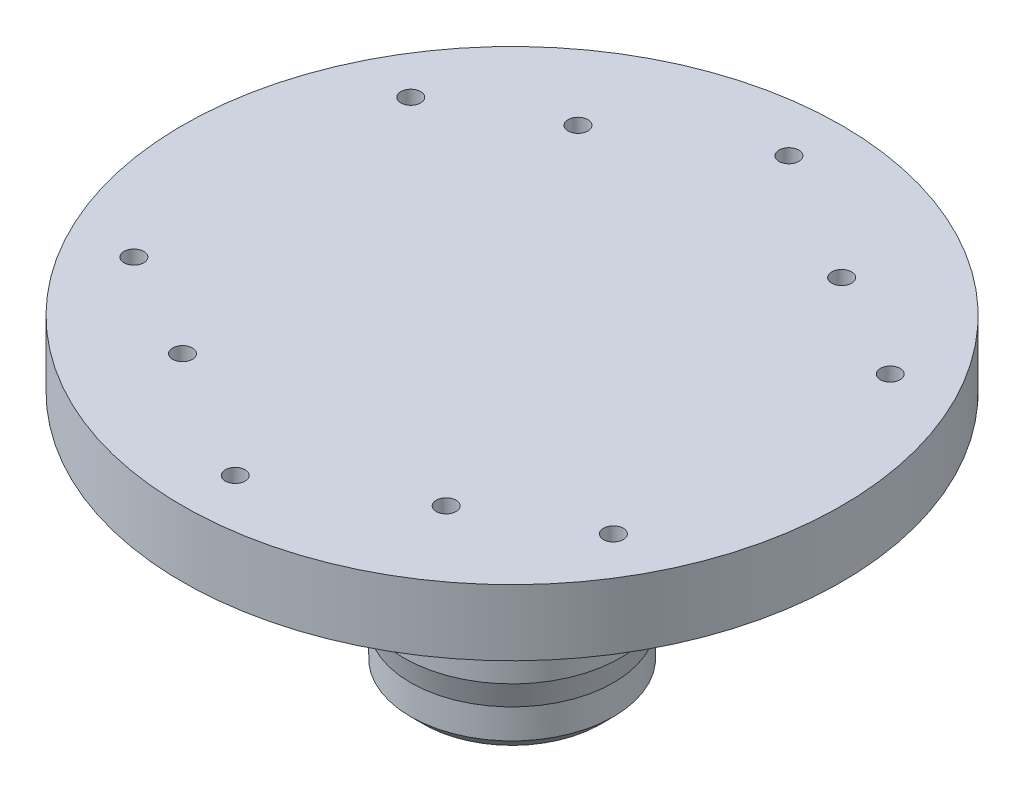
ISO-10303-21;
HEADER;
FILE_DESCRIPTION(('STEP AP214'),'2;1');
FILE_NAME('part.step','',(''),(''),'','','');
FILE_SCHEMA(('AUTOMOTIVE_DESIGN { 1 0 10303 214 1 1 1 1 }'));
ENDSEC;
DATA;
#1=APPLICATION_CONTEXT('core data for automotive mechanical design processes');
#2=APPLICATION_PROTOCOL_DEFINITION('international standard','automotive_design',2000,#1);
#3=PRODUCT_CONTEXT('',#1,'mechanical');
#4=PRODUCT('Part','Part','',(#3));
#5=PRODUCT_RELATED_PRODUCT_CATEGORY('part','',(#4));
#6=PRODUCT_DEFINITION_FORMATION('','',#4);
#7=PRODUCT_DEFINITION_CONTEXT('part definition',#1,'design');
#8=PRODUCT_DEFINITION('design','',#6,#7);
#9=PRODUCT_DEFINITION_SHAPE('','',#8);
#10=(LENGTH_UNIT() NAMED_UNIT(*) SI_UNIT(.MILLI.,.METRE.));
#11=(NAMED_UNIT(*) PLANE_ANGLE_UNIT() SI_UNIT($,.RADIAN.));
#12=(NAMED_UNIT(*) SI_UNIT($,.STERADIAN.) SOLID_ANGLE_UNIT());
#13=UNCERTAINTY_MEASURE_WITH_UNIT(LENGTH_MEASURE(1.E-05),#10,'distance_accuracy_value','');
#14=(GEOMETRIC_REPRESENTATION_CONTEXT(3) GLOBAL_UNCERTAINTY_ASSIGNED_CONTEXT((#13)) GLOBAL_UNIT_ASSIGNED_CONTEXT((#10,
#11,#12)) REPRESENTATION_CONTEXT('',''));
#15=CARTESIAN_POINT('',(0.,0.,0.));
#16=DIRECTION('',(0.,0.,1.));
#17=DIRECTION('',(1.,0.,0.));
#18=AXIS2_PLACEMENT_3D('',#15,#16,#17);
#19=CARTESIAN_POINT('',(10.2,14.5,0.));
#20=DIRECTION('',(0.,-1.,0.));
#21=DIRECTION('',(0.,0.,-1.));
#22=AXIS2_PLACEMENT_3D('',#19,#20,#21);
#23=PLANE('',#22);
#24=CARTESIAN_POINT('',(0.,14.5,0.));
#25=DIRECTION('',(0.,-1.,0.));
#26=DIRECTION('',(0.,0.,-1.));
#27=AXIS2_PLACEMENT_3D('',#24,#25,#26);
#28=CIRCLE('',#27,10.2);
#29=CARTESIAN_POINT('',(0.,14.5,-10.2));
#30=VERTEX_POINT('',#29);
#31=EDGE_CURVE('E68',#30,#30,#28,.T.);
#32=ORIENTED_EDGE('',*,*,#31,.T.);
#33=EDGE_LOOP('',(#32));
#34=FACE_BOUND('',#33,.T.);
#35=CARTESIAN_POINT('',(0.,14.5,0.));
#36=DIRECTION('',(0.,-1.,0.));
#37=DIRECTION('',(0.,0.,-1.));
#38=AXIS2_PLACEMENT_3D('',#35,#36,#37);
#39=CIRCLE('',#38,8.2);
#40=CARTESIAN_POINT('',(0.,14.5,-8.2));
#41=VERTEX_POINT('',#40);
#42=EDGE_CURVE('E84',#41,#41,#39,.T.);
#43=ORIENTED_EDGE('',*,*,#42,.F.);
#44=EDGE_LOOP('',(#43));
#45=FACE_BOUND('',#44,.T.);
#46=ADVANCED_FACE('F43',(#34,#45),#23,.T.);
#47=CARTESIAN_POINT('',(0.,0.,0.));
#48=DIRECTION('',(0.,-1.,0.));
#49=DIRECTION('',(0.,0.,-1.));
#50=AXIS2_PLACEMENT_3D('',#47,#48,#49);
#51=CYLINDRICAL_SURFACE('',#50,10.2);
#52=CARTESIAN_POINT('',(0.,18.5,0.));
#53=DIRECTION('',(0.,-1.,0.));
#54=DIRECTION('',(0.,0.,-1.));
#55=AXIS2_PLACEMENT_3D('',#52,#53,#54);
#56=CIRCLE('',#55,10.2);
#57=CARTESIAN_POINT('',(0.,18.5,-10.2));
#58=VERTEX_POINT('',#57);
#59=EDGE_CURVE('E72',#58,#58,#56,.T.);
#60=ORIENTED_EDGE('',*,*,#59,.T.);
#61=EDGE_LOOP('',(#60));
#62=FACE_BOUND('',#61,.T.);
#63=ORIENTED_EDGE('',*,*,#31,.F.);
#64=EDGE_LOOP('',(#63));
#65=FACE_BOUND('',#64,.T.);
#66=ADVANCED_FACE('F203',(#62,#65),#51,.T.);
#67=CARTESIAN_POINT('',(10.2,18.5,0.));
#68=DIRECTION('',(0.,-1.,0.));
#69=DIRECTION('',(0.,0.,-1.));
#70=AXIS2_PLACEMENT_3D('',#67,#68,#69);
#71=PLANE('',#70);
#72=CARTESIAN_POINT('',(10.,18.5,15.));
#73=DIRECTION('',(0.,-1.,0.));
#74=DIRECTION('',(0.,0.,-1.));
#75=AXIS2_PLACEMENT_3D('',#72,#73,#74);
#76=CIRCLE('',#75,0.75);
#77=CARTESIAN_POINT('',(10.,18.5,14.25));
#78=VERTEX_POINT('',#77);
#79=EDGE_CURVE('E126',#78,#78,#76,.T.);
#80=ORIENTED_EDGE('',*,*,#79,.F.);
#81=EDGE_LOOP('',(#80));
#82=FACE_BOUND('',#81,.T.);
#83=CARTESIAN_POINT('',(-10.,18.5,-15.));
#84=DIRECTION('',(0.,-1.,0.));
#85=DIRECTION('',(0.,0.,-1.));
#86=AXIS2_PLACEMENT_3D('',#83,#84,#85);
#87=CIRCLE('',#86,0.75);
#88=CARTESIAN_POINT('',(-10.,18.5,-15.75));
#89=VERTEX_POINT('',#88);
#90=EDGE_CURVE('E140',#89,#89,#87,.T.);
#91=ORIENTED_EDGE('',*,*,#90,.F.);
#92=EDGE_LOOP('',(#91));
#93=FACE_BOUND('',#92,.T.);
#94=CARTESIAN_POINT('',(-10.,18.5,15.));
#95=DIRECTION('',(0.,-1.,0.));
#96=DIRECTION('',(0.,0.,-1.));
#97=AXIS2_PLACEMENT_3D('',#94,#95,#96);
#98=CIRCLE('',#97,0.75);
#99=CARTESIAN_POINT('',(-10.,18.5,14.25));
#100=VERTEX_POINT('',#99);
#101=EDGE_CURVE('E144',#100,#100,#98,.T.);
#102=ORIENTED_EDGE('',*,*,#101,.F.);
#103=EDGE_LOOP('',(#102));
#104=FACE_BOUND('',#103,.T.);
#105=CARTESIAN_POINT('',(10.,18.5,-15.));
#106=DIRECTION('',(0.,-1.,0.));
#107=DIRECTION('',(0.,0.,-1.));
#108=AXIS2_PLACEMENT_3D('',#105,#106,#107);
#109=CIRCLE('',#108,0.75);
#110=CARTESIAN_POINT('',(10.,18.5,-15.75));
#111=VERTEX_POINT('',#110);
#112=EDGE_CURVE('E148',#111,#111,#109,.T.);
#113=ORIENTED_EDGE('',*,*,#112,.F.);
#114=EDGE_LOOP('',(#113));
#115=FACE_BOUND('',#114,.T.);
#116=CARTESIAN_POINT('',(18.1865334794731,18.5,-10.5000000000002));
#117=DIRECTION('',(0.,-1.,0.));
#118=DIRECTION('',(0.,0.,-1.));
#119=AXIS2_PLACEMENT_3D('',#116,#117,#118);
#120=CIRCLE('',#119,0.750000000000001);
#121=CARTESIAN_POINT('',(18.1865334794731,18.5,-11.2500000000002));
#122=VERTEX_POINT('',#121);
#123=EDGE_CURVE('E96',#122,#122,#120,.T.);
#124=ORIENTED_EDGE('',*,*,#123,.F.);
#125=EDGE_LOOP('',(#124));
#126=FACE_BOUND('',#125,.T.);
#127=CARTESIAN_POINT('',(18.1865334794733,18.5,10.4999999999998));
#128=DIRECTION('',(0.,-1.,0.));
#129=DIRECTION('',(0.,0.,-1.));
#130=AXIS2_PLACEMENT_3D('',#127,#128,#129);
#131=CIRCLE('',#130,0.750000000000001);
#132=CARTESIAN_POINT('',(18.1865334794733,18.5,9.74999999999983));
#133=VERTEX_POINT('',#132);
#134=EDGE_CURVE('E100',#133,#133,#131,.T.);
#135=ORIENTED_EDGE('',*,*,#134,.F.);
#136=EDGE_LOOP('',(#135));
#137=FACE_BOUND('',#136,.T.);
#138=CARTESIAN_POINT('',(0.,18.5,21.));
#139=DIRECTION('',(0.,-1.,0.));
#140=DIRECTION('',(0.,0.,-1.));
#141=AXIS2_PLACEMENT_3D('',#138,#139,#140);
#142=CIRCLE('',#141,0.750000000000001);
#143=CARTESIAN_POINT('',(0.,18.5,20.25));
#144=VERTEX_POINT('',#143);
#145=EDGE_CURVE('E104',#144,#144,#142,.T.);
#146=ORIENTED_EDGE('',*,*,#145,.F.);
#147=EDGE_LOOP('',(#146));
#148=FACE_BOUND('',#147,.T.);
#149=CARTESIAN_POINT('',(-18.1865334794732,18.5,10.5000000000001));
#150=DIRECTION('',(0.,-1.,0.));
#151=DIRECTION('',(0.,0.,-1.));
#152=AXIS2_PLACEMENT_3D('',#149,#150,#151);
#153=CIRCLE('',#152,0.750000000000001);
#154=CARTESIAN_POINT('',(-18.1865334794732,18.5,9.75000000000009));
#155=VERTEX_POINT('',#154);
#156=EDGE_CURVE('E108',#155,#155,#153,.T.);
#157=ORIENTED_EDGE('',*,*,#156,.F.);
#158=EDGE_LOOP('',(#157));
#159=FACE_BOUND('',#158,.T.);
#160=CARTESIAN_POINT('',(-18.1865334794732,18.5,-10.5));
#161=DIRECTION('',(0.,-1.,0.));
#162=DIRECTION('',(0.,0.,-1.));
#163=AXIS2_PLACEMENT_3D('',#160,#161,#162);
#164=CIRCLE('',#163,0.750000000000001);
#165=CARTESIAN_POINT('',(-18.1865334794732,18.5,-11.25));
#166=VERTEX_POINT('',#165);
#167=EDGE_CURVE('E112',#166,#166,#164,.T.);
#168=ORIENTED_EDGE('',*,*,#167,.F.);
#169=EDGE_LOOP('',(#168));
#170=FACE_BOUND('',#169,.T.);
#171=CARTESIAN_POINT('',(0.,18.5,-21.));
#172=DIRECTION('',(0.,-1.,0.));
#173=DIRECTION('',(0.,0.,-1.));
#174=AXIS2_PLACEMENT_3D('',#171,#172,#173);
#175=CIRCLE('',#174,0.750000000000001);
#176=CARTESIAN_POINT('',(0.,18.5,-21.75));
#177=VERTEX_POINT('',#176);
#178=EDGE_CURVE('E88',#177,#177,#175,.T.);
#179=ORIENTED_EDGE('',*,*,#178,.F.);
#180=EDGE_LOOP('',(#179));
#181=FACE_BOUND('',#180,.T.);
#182=CARTESIAN_POINT('',(0.,18.5,0.));
#183=DIRECTION('',(0.,-1.,0.));
#184=DIRECTION('',(0.,0.,-1.));
#185=AXIS2_PLACEMENT_3D('',#182,#183,#184);
#186=CIRCLE('',#185,25.);
#187=CARTESIAN_POINT('',(0.,18.5,-25.));
#188=VERTEX_POINT('',#187);
#189=EDGE_CURVE('E76',#188,#188,#186,.T.);
#190=ORIENTED_EDGE('',*,*,#189,.T.);
#191=EDGE_LOOP('',(#190));
#192=FACE_BOUND('',#191,.T.);
#193=ORIENTED_EDGE('',*,*,#59,.F.);
#194=EDGE_LOOP('',(#193));
#195=FACE_BOUND('',#194,.T.);
#196=ADVANCED_FACE('F209',(#82,#93,#104,#115,#126,#137,#148,#159,#170,#181,#192,#195),#71,.T.);
#197=CARTESIAN_POINT('',(0.,0.,0.));
#198=DIRECTION('',(0.,-1.,0.));
#199=DIRECTION('',(0.,0.,-1.));
#200=AXIS2_PLACEMENT_3D('',#197,#198,#199);
#201=CYLINDRICAL_SURFACE('',#200,25.);
#202=CARTESIAN_POINT('',(0.,23.5,0.));
#203=DIRECTION('',(0.,-1.,0.));
#204=DIRECTION('',(0.,0.,-1.));
#205=AXIS2_PLACEMENT_3D('',#202,#203,#204);
#206=CIRCLE('',#205,25.);
#207=CARTESIAN_POINT('',(0.,23.5,-25.));
#208=VERTEX_POINT('',#207);
#209=EDGE_CURVE('E80',#208,#208,#206,.T.);
#210=ORIENTED_EDGE('',*,*,#209,.T.);
#211=EDGE_LOOP('',(#210));
#212=FACE_BOUND('',#211,.T.);
#213=ORIENTED_EDGE('',*,*,#189,.F.);
#214=EDGE_LOOP('',(#213));
#215=FACE_BOUND('',#214,.T.);
#216=ADVANCED_FACE('F281',(#212,#215),#201,.T.);
#217=CARTESIAN_POINT('',(25.,23.5,0.));
#218=DIRECTION('',(0.,1.,0.));
#219=DIRECTION('',(0.,0.,1.));
#220=AXIS2_PLACEMENT_3D('',#217,#218,#219);
#221=PLANE('',#220);
#222=CARTESIAN_POINT('',(10.,23.5,15.));
#223=DIRECTION('',(0.,1.,0.));
#224=DIRECTION('',(0.,0.,1.));
#225=AXIS2_PLACEMENT_3D('',#222,#223,#224);
#226=CIRCLE('',#225,0.75);
#227=CARTESIAN_POINT('',(10.,23.5,15.75));
#228=VERTEX_POINT('',#227);
#229=EDGE_CURVE('E157',#228,#228,#226,.T.);
#230=ORIENTED_EDGE('',*,*,#229,.F.);
#231=EDGE_LOOP('',(#230));
#232=FACE_BOUND('',#231,.T.);
#233=CARTESIAN_POINT('',(-10.,23.5,-15.));
#234=DIRECTION('',(0.,1.,0.));
#235=DIRECTION('',(0.,0.,1.));
#236=AXIS2_PLACEMENT_3D('',#233,#234,#235);
#237=CIRCLE('',#236,0.75);
#238=CARTESIAN_POINT('',(-10.,23.5,-14.25));
#239=VERTEX_POINT('',#238);
#240=EDGE_CURVE('E161',#239,#239,#237,.T.);
#241=ORIENTED_EDGE('',*,*,#240,.F.);
#242=EDGE_LOOP('',(#241));
#243=FACE_BOUND('',#242,.T.);
#244=CARTESIAN_POINT('',(-10.,23.5,15.));
#245=DIRECTION('',(0.,1.,0.));
#246=DIRECTION('',(0.,0.,1.));
#247=AXIS2_PLACEMENT_3D('',#244,#245,#246);
#248=CIRCLE('',#247,0.75);
#249=CARTESIAN_POINT('',(-10.,23.5,15.75));
#250=VERTEX_POINT('',#249);
#251=EDGE_CURVE('E156',#250,#250,#248,.T.);
#252=ORIENTED_EDGE('',*,*,#251,.F.);
#253=EDGE_LOOP('',(#252));
#254=FACE_BOUND('',#253,.T.);
#255=CARTESIAN_POINT('',(10.,23.5,-15.));
#256=DIRECTION('',(0.,1.,0.));
#257=DIRECTION('',(0.,0.,1.));
#258=AXIS2_PLACEMENT_3D('',#255,#256,#257);
#259=CIRCLE('',#258,0.75);
#260=CARTESIAN_POINT('',(10.,23.5,-14.25));
#261=VERTEX_POINT('',#260);
#262=EDGE_CURVE('E152',#261,#261,#259,.T.);
#263=ORIENTED_EDGE('',*,*,#262,.F.);
#264=EDGE_LOOP('',(#263));
#265=FACE_BOUND('',#264,.T.);
#266=CARTESIAN_POINT('',(18.1865334794731,23.5,-10.5000000000002));
#267=DIRECTION('',(0.,1.,0.));
#268=DIRECTION('',(-0.866025403784433,0.,0.50000000000001));
#269=AXIS2_PLACEMENT_3D('',#266,#267,#268);
#270=CIRCLE('',#269,0.750000000000001);
#271=CARTESIAN_POINT('',(17.5370144266348,23.5,-10.1250000000002));
#272=VERTEX_POINT('',#271);
#273=EDGE_CURVE('E121',#272,#272,#270,.T.);
#274=ORIENTED_EDGE('',*,*,#273,.F.);
#275=EDGE_LOOP('',(#274));
#276=FACE_BOUND('',#275,.T.);
#277=CARTESIAN_POINT('',(18.1865334794733,23.5,10.4999999999998));
#278=DIRECTION('',(0.,1.,0.));
#279=DIRECTION('',(-0.866025403784443,0.,-0.499999999999992));
#280=AXIS2_PLACEMENT_3D('',#277,#278,#279);
#281=CIRCLE('',#280,0.750000000000001);
#282=CARTESIAN_POINT('',(17.537014426635,23.5,10.1249999999998));
#283=VERTEX_POINT('',#282);
#284=EDGE_CURVE('E125',#283,#283,#281,.T.);
#285=ORIENTED_EDGE('',*,*,#284,.F.);
#286=EDGE_LOOP('',(#285));
#287=FACE_BOUND('',#286,.T.);
#288=CARTESIAN_POINT('',(0.,23.5,21.));
#289=DIRECTION('',(0.,1.,0.));
#290=DIRECTION('',(0.,0.,-1.));
#291=AXIS2_PLACEMENT_3D('',#288,#289,#290);
#292=CIRCLE('',#291,0.750000000000001);
#293=CARTESIAN_POINT('',(0.,23.5,20.25));
#294=VERTEX_POINT('',#293);
#295=EDGE_CURVE('E130',#294,#294,#292,.T.);
#296=ORIENTED_EDGE('',*,*,#295,.F.);
#297=EDGE_LOOP('',(#296));
#298=FACE_BOUND('',#297,.T.);
#299=CARTESIAN_POINT('',(-18.1865334794732,23.5,10.5000000000001));
#300=DIRECTION('',(0.,1.,0.));
#301=DIRECTION('',(0.866025403784436,0.,-0.500000000000004));
#302=AXIS2_PLACEMENT_3D('',#299,#300,#301);
#303=CIRCLE('',#302,0.750000000000001);
#304=CARTESIAN_POINT('',(-17.5370144266348,23.5,10.1250000000001));
#305=VERTEX_POINT('',#304);
#306=EDGE_CURVE('E120',#305,#305,#303,.T.);
#307=ORIENTED_EDGE('',*,*,#306,.F.);
#308=EDGE_LOOP('',(#307));
#309=FACE_BOUND('',#308,.T.);
#310=CARTESIAN_POINT('',(-18.1865334794732,23.5,-10.5));
#311=DIRECTION('',(0.,1.,0.));
#312=DIRECTION('',(0.86602540378444,0.,0.499999999999998));
#313=AXIS2_PLACEMENT_3D('',#310,#311,#312);
#314=CIRCLE('',#313,0.750000000000001);
#315=CARTESIAN_POINT('',(-17.5370144266349,23.5,-10.125));
#316=VERTEX_POINT('',#315);
#317=EDGE_CURVE('E116',#316,#316,#314,.T.);
#318=ORIENTED_EDGE('',*,*,#317,.F.);
#319=EDGE_LOOP('',(#318));
#320=FACE_BOUND('',#319,.T.);
#321=CARTESIAN_POINT('',(0.,23.5,-21.));
#322=DIRECTION('',(0.,1.,0.));
#323=DIRECTION('',(0.,0.,1.));
#324=AXIS2_PLACEMENT_3D('',#321,#322,#323);
#325=CIRCLE('',#324,0.750000000000001);
#326=CARTESIAN_POINT('',(0.,23.5,-20.25));
#327=VERTEX_POINT('',#326);
#328=EDGE_CURVE('E92',#327,#327,#325,.T.);
#329=ORIENTED_EDGE('',*,*,#328,.F.);
#330=EDGE_LOOP('',(#329));
#331=FACE_BOUND('',#330,.T.);
#332=ORIENTED_EDGE('',*,*,#209,.F.);
#333=EDGE_LOOP('',(#332));
#334=FACE_BOUND('',#333,.T.);
#335=ADVANCED_FACE('F277',(#232,#243,#254,#265,#276,#287,#298,#309,#320,#331,#334),#221,.T.);
#336=CARTESIAN_POINT('',(0.,0.,0.));
#337=DIRECTION('',(0.,-1.,0.));
#338=DIRECTION('',(0.,0.,-1.));
#339=AXIS2_PLACEMENT_3D('',#336,#337,#338);
#340=CYLINDRICAL_SURFACE('',#339,8.2);
#341=CARTESIAN_POINT('',(0.,5.1,0.));
#342=DIRECTION('',(0.,1.,0.));
#343=DIRECTION('',(0.,0.,1.));
#344=AXIS2_PLACEMENT_3D('',#341,#342,#343);
#345=CIRCLE('',#344,8.2);
#346=CARTESIAN_POINT('',(0.,5.1,8.2));
#347=VERTEX_POINT('',#346);
#348=EDGE_CURVE('E176',#347,#347,#345,.T.);
#349=ORIENTED_EDGE('',*,*,#348,.T.);
#350=EDGE_LOOP('',(#349));
#351=FACE_BOUND('',#350,.T.);
#352=ORIENTED_EDGE('',*,*,#42,.T.);
#353=EDGE_LOOP('',(#352));
#354=FACE_BOUND('',#353,.T.);
#355=ADVANCED_FACE('F181',(#351,#354),#340,.T.);
#356=CARTESIAN_POINT('',(0.,0.,-21.));
#357=DIRECTION('',(0.,1.,0.));
#358=DIRECTION('',(0.,0.,1.));
#359=AXIS2_PLACEMENT_3D('',#356,#357,#358);
#360=CYLINDRICAL_SURFACE('',#359,0.750000000000001);
#361=ORIENTED_EDGE('',*,*,#178,.T.);
#362=EDGE_LOOP('',(#361));
#363=FACE_BOUND('',#362,.T.);
#364=ORIENTED_EDGE('',*,*,#328,.T.);
#365=EDGE_LOOP('',(#364));
#366=FACE_BOUND('',#365,.T.);
#367=ADVANCED_FACE('F271',(#363,#366),#360,.F.);
#368=CARTESIAN_POINT('',(-18.1865334794732,0.,-10.5));
#369=DIRECTION('',(0.,1.,0.));
#370=DIRECTION('',(0.,0.,1.));
#371=AXIS2_PLACEMENT_3D('',#368,#369,#370);
#372=CYLINDRICAL_SURFACE('',#371,0.750000000000001);
#373=ORIENTED_EDGE('',*,*,#167,.T.);
#374=EDGE_LOOP('',(#373));
#375=FACE_BOUND('',#374,.T.);
#376=ORIENTED_EDGE('',*,*,#317,.T.);
#377=EDGE_LOOP('',(#376));
#378=FACE_BOUND('',#377,.T.);
#379=ADVANCED_FACE('F257',(#375,#378),#372,.F.);
#380=CARTESIAN_POINT('',(-18.1865334794732,0.,10.5000000000001));
#381=DIRECTION('',(0.,1.,0.));
#382=DIRECTION('',(0.,0.,1.));
#383=AXIS2_PLACEMENT_3D('',#380,#381,#382);
#384=CYLINDRICAL_SURFACE('',#383,0.750000000000001);
#385=ORIENTED_EDGE('',*,*,#156,.T.);
#386=EDGE_LOOP('',(#385));
#387=FACE_BOUND('',#386,.T.);
#388=ORIENTED_EDGE('',*,*,#306,.T.);
#389=EDGE_LOOP('',(#388));
#390=FACE_BOUND('',#389,.T.);
#391=ADVANCED_FACE('F253',(#387,#390),#384,.F.);
#392=CARTESIAN_POINT('',(0.,0.,21.));
#393=DIRECTION('',(0.,1.,0.));
#394=DIRECTION('',(0.,0.,1.));
#395=AXIS2_PLACEMENT_3D('',#392,#393,#394);
#396=CYLINDRICAL_SURFACE('',#395,0.750000000000001);
#397=ORIENTED_EDGE('',*,*,#145,.T.);
#398=EDGE_LOOP('',(#397));
#399=FACE_BOUND('',#398,.T.);
#400=ORIENTED_EDGE('',*,*,#295,.T.);
#401=EDGE_LOOP('',(#400));
#402=FACE_BOUND('',#401,.T.);
#403=ADVANCED_FACE('F256',(#399,#402),#396,.F.);
#404=CARTESIAN_POINT('',(18.1865334794733,0.,10.4999999999998));
#405=DIRECTION('',(0.,1.,0.));
#406=DIRECTION('',(0.,0.,1.));
#407=AXIS2_PLACEMENT_3D('',#404,#405,#406);
#408=CYLINDRICAL_SURFACE('',#407,0.750000000000001);
#409=ORIENTED_EDGE('',*,*,#134,.T.);
#410=EDGE_LOOP('',(#409));
#411=FACE_BOUND('',#410,.T.);
#412=ORIENTED_EDGE('',*,*,#284,.T.);
#413=EDGE_LOOP('',(#412));
#414=FACE_BOUND('',#413,.T.);
#415=ADVANCED_FACE('F261',(#411,#414),#408,.F.);
#416=CARTESIAN_POINT('',(18.1865334794731,0.,-10.5000000000002));
#417=DIRECTION('',(0.,1.,0.));
#418=DIRECTION('',(0.,0.,1.));
#419=AXIS2_PLACEMENT_3D('',#416,#417,#418);
#420=CYLINDRICAL_SURFACE('',#419,0.750000000000001);
#421=ORIENTED_EDGE('',*,*,#123,.T.);
#422=EDGE_LOOP('',(#421));
#423=FACE_BOUND('',#422,.T.);
#424=ORIENTED_EDGE('',*,*,#273,.T.);
#425=EDGE_LOOP('',(#424));
#426=FACE_BOUND('',#425,.T.);
#427=ADVANCED_FACE('F251',(#423,#426),#420,.F.);
#428=CARTESIAN_POINT('',(10.,0.,-15.));
#429=DIRECTION('',(0.,1.,0.));
#430=DIRECTION('',(0.,0.,1.));
#431=AXIS2_PLACEMENT_3D('',#428,#429,#430);
#432=CYLINDRICAL_SURFACE('',#431,0.75);
#433=ORIENTED_EDGE('',*,*,#112,.T.);
#434=EDGE_LOOP('',(#433));
#435=FACE_BOUND('',#434,.T.);
#436=ORIENTED_EDGE('',*,*,#262,.T.);
#437=EDGE_LOOP('',(#436));
#438=FACE_BOUND('',#437,.T.);
#439=ADVANCED_FACE('F244',(#435,#438),#432,.F.);
#440=CARTESIAN_POINT('',(-10.,0.,15.));
#441=DIRECTION('',(0.,1.,0.));
#442=DIRECTION('',(0.,0.,1.));
#443=AXIS2_PLACEMENT_3D('',#440,#441,#442);
#444=CYLINDRICAL_SURFACE('',#443,0.75);
#445=ORIENTED_EDGE('',*,*,#101,.T.);
#446=EDGE_LOOP('',(#445));
#447=FACE_BOUND('',#446,.T.);
#448=ORIENTED_EDGE('',*,*,#251,.T.);
#449=EDGE_LOOP('',(#448));
#450=FACE_BOUND('',#449,.T.);
#451=ADVANCED_FACE('F241',(#447,#450),#444,.F.);
#452=CARTESIAN_POINT('',(-10.,0.,-15.));
#453=DIRECTION('',(0.,1.,0.));
#454=DIRECTION('',(0.,0.,1.));
#455=AXIS2_PLACEMENT_3D('',#452,#453,#454);
#456=CYLINDRICAL_SURFACE('',#455,0.75);
#457=ORIENTED_EDGE('',*,*,#90,.T.);
#458=EDGE_LOOP('',(#457));
#459=FACE_BOUND('',#458,.T.);
#460=ORIENTED_EDGE('',*,*,#240,.T.);
#461=EDGE_LOOP('',(#460));
#462=FACE_BOUND('',#461,.T.);
#463=ADVANCED_FACE('F198',(#459,#462),#456,.F.);
#464=CARTESIAN_POINT('',(10.,0.,15.));
#465=DIRECTION('',(0.,1.,0.));
#466=DIRECTION('',(0.,0.,1.));
#467=AXIS2_PLACEMENT_3D('',#464,#465,#466);
#468=CYLINDRICAL_SURFACE('',#467,0.75);
#469=ORIENTED_EDGE('',*,*,#79,.T.);
#470=EDGE_LOOP('',(#469));
#471=FACE_BOUND('',#470,.T.);
#472=ORIENTED_EDGE('',*,*,#229,.T.);
#473=EDGE_LOOP('',(#472));
#474=FACE_BOUND('',#473,.T.);
#475=ADVANCED_FACE('F193',(#471,#474),#468,.F.);
#476=CARTESIAN_POINT('',(0.,14.5,0.));
#477=DIRECTION('',(0.,1.,0.));
#478=DIRECTION('',(0.,0.,1.));
#479=AXIS2_PLACEMENT_3D('',#476,#477,#478);
#480=CYLINDRICAL_SURFACE('',#479,7.7);
#481=CARTESIAN_POINT('',(0.,0.999999999999987,0.));
#482=DIRECTION('',(0.,-1.,0.));
#483=DIRECTION('',(0.,0.,-1.));
#484=AXIS2_PLACEMENT_3D('',#481,#482,#483);
#485=CIRCLE('',#484,7.7);
#486=CARTESIAN_POINT('',(0.,0.999999999999987,-7.7));
#487=VERTEX_POINT('',#486);
#488=EDGE_CURVE('E52',#487,#487,#485,.F.);
#489=ORIENTED_EDGE('',*,*,#488,.T.);
#490=EDGE_LOOP('',(#489));
#491=FACE_BOUND('',#490,.T.);
#492=CARTESIAN_POINT('',(0.,3.23397459621551,0.));
#493=DIRECTION('',(0.,1.,0.));
#494=DIRECTION('',(0.,0.,1.));
#495=AXIS2_PLACEMENT_3D('',#492,#493,#494);
#496=CIRCLE('',#495,7.7);
#497=CARTESIAN_POINT('',(0.,3.23397459621551,7.7));
#498=VERTEX_POINT('',#497);
#499=EDGE_CURVE('E172',#498,#498,#496,.T.);
#500=ORIENTED_EDGE('',*,*,#499,.F.);
#501=EDGE_LOOP('',(#500));
#502=FACE_BOUND('',#501,.T.);
#503=ADVANCED_FACE('F188',(#491,#502),#480,.T.);
#504=CARTESIAN_POINT('',(0.,3.23397459621551,0.));
#505=DIRECTION('',(0.,1.,0.));
#506=DIRECTION('',(0.,0.,1.));
#507=AXIS2_PLACEMENT_3D('',#504,#505,#506);
#508=CONICAL_SURFACE('',#507,7.7,0.261799387799143);
#509=ORIENTED_EDGE('',*,*,#348,.F.);
#510=EDGE_LOOP('',(#509));
#511=FACE_BOUND('',#510,.T.);
#512=ORIENTED_EDGE('',*,*,#499,.T.);
#513=EDGE_LOOP('',(#512));
#514=FACE_BOUND('',#513,.T.);
#515=ADVANCED_FACE('F184',(#511,#514),#508,.T.);
#516=CARTESIAN_POINT('',(0.,4.,0.));
#517=DIRECTION('',(0.,-1.,0.));
#518=DIRECTION('',(0.,0.,-1.));
#519=AXIS2_PLACEMENT_3D('',#516,#517,#518);
#520=PLANE('',#519);
#521=CARTESIAN_POINT('',(0.,4.,0.));
#522=DIRECTION('',(0.,-1.,0.));
#523=DIRECTION('',(0.,0.,-1.));
#524=AXIS2_PLACEMENT_3D('',#521,#522,#523);
#525=CIRCLE('',#524,2.6);
#526=CARTESIAN_POINT('',(0.,4.,-2.6));
#527=VERTEX_POINT('',#526);
#528=EDGE_CURVE('E162',#527,#527,#525,.T.);
#529=ORIENTED_EDGE('',*,*,#528,.T.);
#530=EDGE_LOOP('',(#529));
#531=FACE_BOUND('',#530,.T.);
#532=ADVANCED_FACE('F187',(#531),#520,.T.);
#533=CARTESIAN_POINT('',(0.,4.,0.));
#534=DIRECTION('',(0.,-1.,0.));
#535=DIRECTION('',(0.,0.,-1.));
#536=AXIS2_PLACEMENT_3D('',#533,#534,#535);
#537=CYLINDRICAL_SURFACE('',#536,2.6);
#538=CARTESIAN_POINT('',(0.,0.5,0.));
#539=DIRECTION('',(0.,-1.,0.));
#540=DIRECTION('',(0.,0.,-1.));
#541=AXIS2_PLACEMENT_3D('',#538,#539,#540);
#542=CIRCLE('',#541,2.6);
#543=CARTESIAN_POINT('',(0.,0.5,-2.6));
#544=VERTEX_POINT('',#543);
#545=EDGE_CURVE('E62',#544,#544,#542,.T.);
#546=ORIENTED_EDGE('',*,*,#545,.T.);
#547=EDGE_LOOP('',(#546));
#548=FACE_BOUND('',#547,.T.);
#549=ORIENTED_EDGE('',*,*,#528,.F.);
#550=EDGE_LOOP('',(#549));
#551=FACE_BOUND('',#550,.T.);
#552=ADVANCED_FACE('F226',(#548,#551),#537,.F.);
#553=CARTESIAN_POINT('',(0.,0.,0.));
#554=DIRECTION('',(0.,-1.,0.));
#555=DIRECTION('',(0.,0.,-1.));
#556=AXIS2_PLACEMENT_3D('',#553,#554,#555);
#557=PLANE('',#556);
#558=CARTESIAN_POINT('',(0.,0.,0.));
#559=DIRECTION('',(0.,-1.,0.));
#560=DIRECTION('',(0.,0.,-1.));
#561=AXIS2_PLACEMENT_3D('',#558,#559,#560);
#562=CIRCLE('',#561,6.7);
#563=CARTESIAN_POINT('',(0.,0.,-6.7));
#564=VERTEX_POINT('',#563);
#565=EDGE_CURVE('E10',#564,#564,#562,.T.);
#566=ORIENTED_EDGE('',*,*,#565,.T.);
#567=EDGE_LOOP('',(#566));
#568=FACE_BOUND('',#567,.T.);
#569=CARTESIAN_POINT('',(0.,0.,0.));
#570=DIRECTION('',(0.,-1.,0.));
#571=DIRECTION('',(0.,0.,-1.));
#572=AXIS2_PLACEMENT_3D('',#569,#570,#571);
#573=CIRCLE('',#572,3.1);
#574=CARTESIAN_POINT('',(0.,0.,-3.1));
#575=VERTEX_POINT('',#574);
#576=EDGE_CURVE('E57',#575,#575,#573,.F.);
#577=ORIENTED_EDGE('',*,*,#576,.T.);
#578=EDGE_LOOP('',(#577));
#579=FACE_BOUND('',#578,.T.);
#580=ADVANCED_FACE('F219',(#568,#579),#557,.T.);
#581=CARTESIAN_POINT('',(0.,0.5,0.));
#582=DIRECTION('',(0.,-1.,0.));
#583=DIRECTION('',(0.,0.,-1.));
#584=AXIS2_PLACEMENT_3D('',#581,#582,#583);
#585=CONICAL_SURFACE('',#584,2.6,0.785398163397446);
#586=ORIENTED_EDGE('',*,*,#576,.F.);
#587=EDGE_LOOP('',(#586));
#588=FACE_BOUND('',#587,.T.);
#589=ORIENTED_EDGE('',*,*,#545,.F.);
#590=EDGE_LOOP('',(#589));
#591=FACE_BOUND('',#590,.T.);
#592=ADVANCED_FACE('F215',(#588,#591),#585,.F.);
#593=CARTESIAN_POINT('',(0.,0.999999999999987,0.));
#594=DIRECTION('',(0.,1.,0.));
#595=DIRECTION('',(0.,0.,1.));
#596=AXIS2_PLACEMENT_3D('',#593,#594,#595);
#597=CONICAL_SURFACE('',#596,7.7,0.785398163397452);
#598=ORIENTED_EDGE('',*,*,#565,.F.);
#599=EDGE_LOOP('',(#598));
#600=FACE_BOUND('',#599,.T.);
#601=ORIENTED_EDGE('',*,*,#488,.F.);
#602=EDGE_LOOP('',(#601));
#603=FACE_BOUND('',#602,.T.);
#604=ADVANCED_FACE('F46',(#600,#603),#597,.T.);
#605=CLOSED_SHELL('',(#46,#66,#196,#216,#335,#355,#367,#379,#391,#403,#415,#427,#439,#451,#463,
#475,#503,#515,#532,#552,#580,#592,#604));
#606=MANIFOLD_SOLID_BREP('B2',#605);
#607=ADVANCED_BREP_SHAPE_REPRESENTATION('',(#18,#606),#14);
#608=SHAPE_DEFINITION_REPRESENTATION(#9,#607);
ENDSEC;
END-ISO-10303-21;
